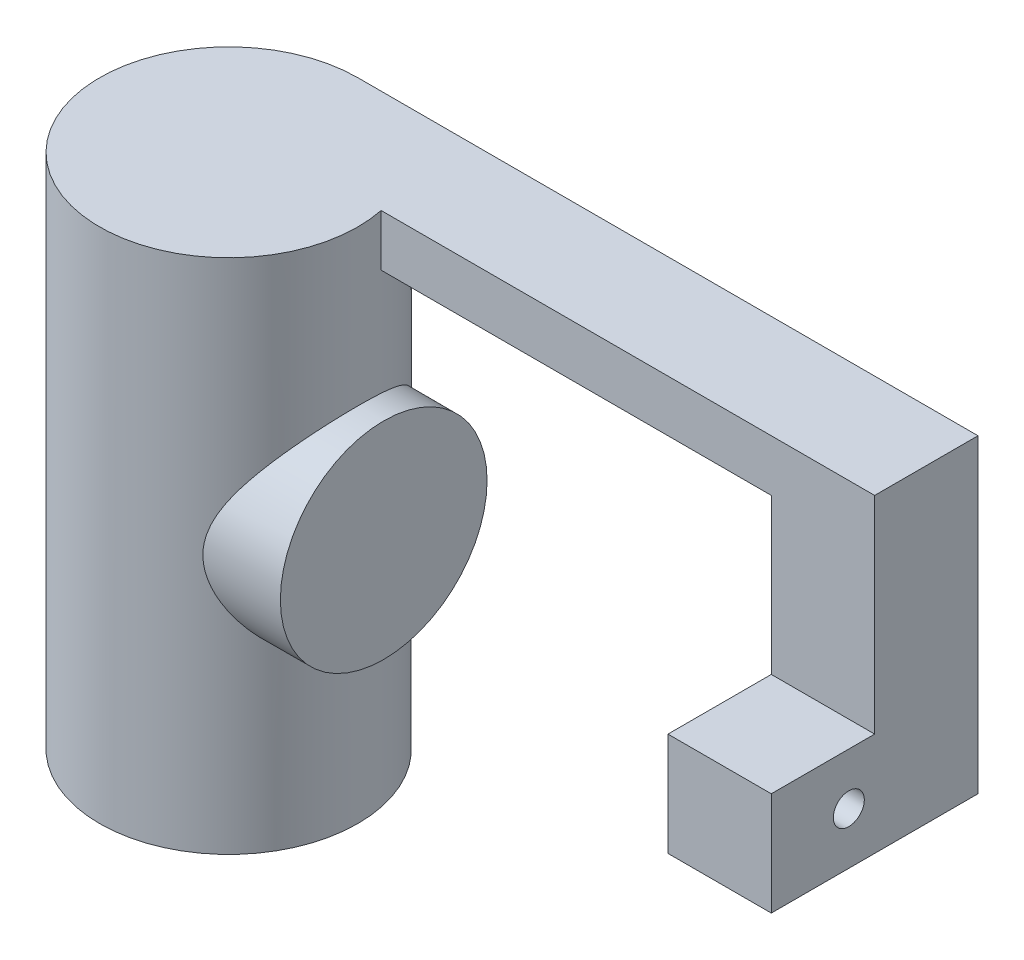
ISO-10303-21;
HEADER;
FILE_DESCRIPTION(('STEP AP214'),'2;1');
FILE_NAME('part.step','',(''),(''),'','','');
FILE_SCHEMA(('AUTOMOTIVE_DESIGN { 1 0 10303 214 1 1 1 1 }'));
ENDSEC;
DATA;
#1=APPLICATION_CONTEXT('core data for automotive mechanical design processes');
#2=APPLICATION_PROTOCOL_DEFINITION('international standard','automotive_design',2000,#1);
#3=PRODUCT_CONTEXT('',#1,'mechanical');
#4=PRODUCT('Part','Part','',(#3));
#5=PRODUCT_RELATED_PRODUCT_CATEGORY('part','',(#4));
#6=PRODUCT_DEFINITION_FORMATION('','',#4);
#7=PRODUCT_DEFINITION_CONTEXT('part definition',#1,'design');
#8=PRODUCT_DEFINITION('design','',#6,#7);
#9=PRODUCT_DEFINITION_SHAPE('','',#8);
#10=(LENGTH_UNIT() NAMED_UNIT(*) SI_UNIT(.MILLI.,.METRE.));
#11=(NAMED_UNIT(*) PLANE_ANGLE_UNIT() SI_UNIT($,.RADIAN.));
#12=(NAMED_UNIT(*) SI_UNIT($,.STERADIAN.) SOLID_ANGLE_UNIT());
#13=UNCERTAINTY_MEASURE_WITH_UNIT(LENGTH_MEASURE(1.E-05),#10,'distance_accuracy_value','');
#14=(GEOMETRIC_REPRESENTATION_CONTEXT(3) GLOBAL_UNCERTAINTY_ASSIGNED_CONTEXT((#13)) GLOBAL_UNIT_ASSIGNED_CONTEXT((#10,
#11,#12)) REPRESENTATION_CONTEXT('',''));
#15=CARTESIAN_POINT('',(0.,0.,0.));
#16=DIRECTION('',(0.,0.,1.));
#17=DIRECTION('',(1.,0.,0.));
#18=AXIS2_PLACEMENT_3D('',#15,#16,#17);
#19=CARTESIAN_POINT('',(232.360679774998,40.,-5.));
#20=DIRECTION('',(0.,1.,0.));
#21=DIRECTION('',(0.,0.,1.));
#22=AXIS2_PLACEMENT_3D('',#19,#20,#21);
#23=PLANE('',#22);
#24=DIRECTION('',(0.,0.,-1.));
#25=VECTOR('',#24,1.);
#26=CARTESIAN_POINT('',(100.,40.,-5.));
#27=LINE('',#26,#25);
#28=CARTESIAN_POINT('',(100.,40.,-5.));
#29=VERTEX_POINT('',#28);
#30=CARTESIAN_POINT('',(100.,40.,-25.));
#31=VERTEX_POINT('',#30);
#32=EDGE_CURVE('E130',#29,#31,#27,.T.);
#33=ORIENTED_EDGE('',*,*,#32,.F.);
#34=DIRECTION('',(-1.,0.,0.));
#35=VECTOR('',#34,1.);
#36=CARTESIAN_POINT('',(232.360679774998,40.,-5.));
#37=LINE('',#36,#35);
#38=CARTESIAN_POINT('',(24.4948974278318,40.,-5.));
#39=VERTEX_POINT('',#38);
#40=EDGE_CURVE('E62',#29,#39,#37,.T.);
#41=ORIENTED_EDGE('',*,*,#40,.T.);
#42=CARTESIAN_POINT('',(0.,40.,0.));
#43=DIRECTION('',(0.,1.,0.));
#44=DIRECTION('',(0.,0.,1.));
#45=AXIS2_PLACEMENT_3D('',#42,#43,#44);
#46=CIRCLE('',#45,25.);
#47=CARTESIAN_POINT('',(0.,40.,-25.));
#48=VERTEX_POINT('',#47);
#49=EDGE_CURVE('E12',#39,#48,#46,.T.);
#50=ORIENTED_EDGE('',*,*,#49,.T.);
#51=DIRECTION('',(-1.,0.,0.));
#52=VECTOR('',#51,1.);
#53=CARTESIAN_POINT('',(232.360679774998,40.,-25.));
#54=LINE('',#53,#52);
#55=EDGE_CURVE('E153',#31,#48,#54,.T.);
#56=ORIENTED_EDGE('',*,*,#55,.F.);
#57=EDGE_LOOP('',(#33,#41,#50,#56));
#58=FACE_BOUND('',#57,.T.);
#59=ADVANCED_FACE('F39',(#58),#23,.F.);
#60=CARTESIAN_POINT('',(0.,50.,0.));
#61=DIRECTION('',(0.,-1.,0.));
#62=DIRECTION('',(0.,0.,-1.));
#63=AXIS2_PLACEMENT_3D('',#60,#61,#62);
#64=CYLINDRICAL_SURFACE('',#63,25.);
#65=CARTESIAN_POINT('',(15.,0.,20.));
#66=CARTESIAN_POINT('',(15.0000088736725,-0.375561365561585,19.9999962926173));
#67=CARTESIAN_POINT('',(15.0141750346591,-0.751259573291653,19.9893930046637));
#68=CARTESIAN_POINT('',(15.070142772738,-1.49955766359186,19.9472295614098));
#69=CARTESIAN_POINT('',(15.1119631943118,-1.87215525787202,19.9156551156393));
#70=CARTESIAN_POINT('',(15.2213478980294,-2.61223578611677,19.8321780083143));
#71=CARTESIAN_POINT('',(15.2889813033108,-2.97970221671656,19.7802207542779));
#72=CARTESIAN_POINT('',(15.4470727059971,-3.70647875847824,19.6570076475307));
#73=CARTESIAN_POINT('',(15.5375387662973,-4.06578593940734,19.5857449768447));
#74=CARTESIAN_POINT('',(15.7052830755086,-4.65924234796872,19.4512611935685));
#75=CARTESIAN_POINT('',(15.777264008289,-4.89604979318361,19.3929770863774));
#76=CARTESIAN_POINT('',(15.9290175269818,-5.36495838353939,19.2685245813802));
#77=CARTESIAN_POINT('',(16.008787864795,-5.59706086336365,19.2023584571969));
#78=CARTESIAN_POINT('',(16.2583874663851,-6.28639950755564,18.9924204482248));
#79=CARTESIAN_POINT('',(16.438461109604,-6.7365147814177,18.837243748835));
#80=CARTESIAN_POINT('',(16.8189383053475,-7.61808786661511,18.4983342499176));
#81=CARTESIAN_POINT('',(17.0193868879852,-8.04950120855747,18.3145377001011));
#82=CARTESIAN_POINT('',(17.4341293267654,-8.89289471182062,17.9201862603243));
#83=CARTESIAN_POINT('',(17.6484228314515,-9.30487536598581,17.7096320494823));
#84=CARTESIAN_POINT('',(18.1648305832741,-10.2553974120961,17.1819650319468));
#85=CARTESIAN_POINT('',(18.4706788691686,-10.7858294871581,16.8538529821223));
#86=CARTESIAN_POINT('',(19.0880028760279,-11.8118379642277,16.1513803264203));
#87=CARTESIAN_POINT('',(19.3994805823717,-12.3074017550521,15.7770031209023));
#88=CARTESIAN_POINT('',(20.0190040941794,-13.2624424849901,14.9830857260937));
#89=CARTESIAN_POINT('',(20.327052455025,-13.7219480872222,14.5635820504617));
#90=CARTESIAN_POINT('',(20.9321249221037,-14.6033006830766,13.6796522230808));
#91=CARTESIAN_POINT('',(21.2291526745127,-15.025160198026,13.2152411157172));
#92=CARTESIAN_POINT('',(21.748027106478,-15.7488727978038,12.3381233033674));
#93=CARTESIAN_POINT('',(21.9731384202275,-16.0579745515095,11.9333126892403));
#94=CARTESIAN_POINT('',(22.4078243876689,-16.6478331858641,11.0955852490369));
#95=CARTESIAN_POINT('',(22.6173997412604,-16.9285913436069,10.6626696907469));
#96=CARTESIAN_POINT('',(23.0169572465042,-17.4588269628689,9.77028072461787));
#97=CARTESIAN_POINT('',(23.2069637984017,-17.708343465351,9.310841533003));
#98=CARTESIAN_POINT('',(23.5638648098979,-18.1735518121657,8.36653359290353));
#99=CARTESIAN_POINT('',(23.7307631030067,-18.3892492676466,7.88166908075929));
#100=CARTESIAN_POINT('',(24.0129006885665,-18.7518040690791,6.96924325820464));
#101=CARTESIAN_POINT('',(24.132129407249,-18.9041530577568,6.54509212186977));
#102=CARTESIAN_POINT('',(24.3496617753786,-19.1810681740325,5.68257829158782));
#103=CARTESIAN_POINT('',(24.4479675644109,-19.305637142486,5.24421705605759));
#104=CARTESIAN_POINT('',(24.6217593056216,-19.5252538478018,4.3558821644556));
#105=CARTESIAN_POINT('',(24.697253945882,-19.6203128245134,3.90591300054797));
#106=CARTESIAN_POINT('',(24.8239328453673,-19.7795341449066,2.99713406477301));
#107=CARTESIAN_POINT('',(24.875116814311,-19.8436961196631,2.53832418741135));
#108=CARTESIAN_POINT('',(24.9521996672002,-19.9402386753894,1.61360726200759));
#109=CARTESIAN_POINT('',(24.9780091489872,-19.9725068868928,1.1476809523183));
#110=CARTESIAN_POINT('',(25.0034458784075,-20.0043094777888,0.213992042391241));
#111=CARTESIAN_POINT('',(25.0030730756769,-20.0038437942145,-0.253770561377071));
#112=CARTESIAN_POINT('',(24.9761538060095,-19.9701867716747,-1.18736799204042));
#113=CARTESIAN_POINT('',(24.9496064528335,-19.9369943246195,-1.65320275312468));
#114=CARTESIAN_POINT('',(24.8709347186019,-19.8384544172188,-2.57925249006266));
#115=CARTESIAN_POINT('',(24.8188109274667,-19.7731076985111,-3.03946759528277));
#116=CARTESIAN_POINT('',(24.6936449338048,-19.6157650157554,-3.92597136214756));
#117=CARTESIAN_POINT('',(24.6219015200442,-19.5254205018148,-4.35273966221057));
#118=CARTESIAN_POINT('',(24.4579006470034,-19.3182016356292,-5.19571671792422));
#119=CARTESIAN_POINT('',(24.3656441088654,-19.2013284746489,-5.61192594679553));
#120=CARTESIAN_POINT('',(24.1621838322245,-18.9424794722292,-6.43174107520527));
#121=CARTESIAN_POINT('',(24.0509776242432,-18.8005003589476,-6.83534532396913));
#122=CARTESIAN_POINT('',(23.8113816719206,-18.4930035981065,-7.62821449404832));
#123=CARTESIAN_POINT('',(23.6829909080916,-18.3274845539852,-8.01747856287235));
#124=CARTESIAN_POINT('',(23.3977812813461,-17.9574879426194,-8.81708135492414));
#125=CARTESIAN_POINT('',(23.2394155993336,-17.7507939301222,-9.22584184459561));
#126=CARTESIAN_POINT('',(22.906772368539,-17.3130145334012,-10.0232967345393));
#127=CARTESIAN_POINT('',(22.7324939744453,-17.0819278532935,-10.4119900670894));
#128=CARTESIAN_POINT('',(22.3704779605334,-16.5971172246319,-11.1686012750122));
#129=CARTESIAN_POINT('',(22.1827357392803,-16.3433855295415,-11.5365119701174));
#130=CARTESIAN_POINT('',(21.7963253746775,-15.8149386877666,-12.2509255452122));
#131=CARTESIAN_POINT('',(21.5976557576735,-15.5402207089469,-12.5974255243352));
#132=CARTESIAN_POINT('',(21.1500639982279,-14.9125174759115,-13.3378586904546));
#133=CARTESIAN_POINT('',(20.8992219334084,-14.5550685913468,-13.7268549610686));
#134=CARTESIAN_POINT('',(20.3896591476269,-13.8134297991933,-14.4729375752678));
#135=CARTESIAN_POINT('',(20.1309371335264,-13.4292354891031,-14.8300186431678));
#136=CARTESIAN_POINT('',(19.6099503005857,-12.6348803465673,-15.5123917113823));
#137=CARTESIAN_POINT('',(19.3476817054736,-12.2246897841468,-15.8376461922545));
#138=CARTESIAN_POINT('',(18.8249798408101,-11.3793795574921,-16.4555095922113));
#139=CARTESIAN_POINT('',(18.5645463549802,-10.9442628880631,-16.7481224207045));
#140=CARTESIAN_POINT('',(18.0760476169757,-10.0922382908298,-17.2734617260135));
#141=CARTESIAN_POINT('',(17.8472812713524,-9.67761490271183,-17.5092418134772));
#142=CARTESIAN_POINT('',(17.4010467415081,-8.82764455668295,-17.9527853755262));
#143=CARTESIAN_POINT('',(17.1835798514243,-8.39229523590542,-18.1605456453044));
#144=CARTESIAN_POINT('',(16.766490943437,-7.50132950291147,-18.5463023979791));
#145=CARTESIAN_POINT('',(16.5668389427307,-7.04574915271813,-18.7243493460744));
#146=CARTESIAN_POINT('',(16.1924320055337,-6.11365179288613,-19.0490562055205));
#147=CARTESIAN_POINT('',(16.0176656946503,-5.63714447939481,-19.1957304717373));
#148=CARTESIAN_POINT('',(15.7494779227909,-4.81134027770838,-19.4158267954433));
#149=CARTESIAN_POINT('',(15.6474408209615,-4.46715880626483,-19.4979866901541));
#150=CARTESIAN_POINT('',(15.4628513048279,-3.7699691020778,-19.644697477778));
#151=CARTESIAN_POINT('',(15.3802925740366,-3.41696377193502,-19.7092540801845));
#152=CARTESIAN_POINT('',(15.2378089632064,-2.70415887126981,-19.8196196469868));
#153=CARTESIAN_POINT('',(15.1778430449527,-2.34437287828416,-19.8654626161209));
#154=CARTESIAN_POINT('',(15.0829006253516,-1.61954026555112,-19.9376452096634));
#155=CARTESIAN_POINT('',(15.0479235746009,-1.25449376164095,-19.9639852628618));
#156=CARTESIAN_POINT('',(15.004495765486,-0.519741930356911,-19.9966465151378));
#157=CARTESIAN_POINT('',(14.9962026395826,-0.150021824373883,-20.0028487541605));
#158=CARTESIAN_POINT('',(15.0070056423833,0.588778260838356,-19.9947448333189));
#159=CARTESIAN_POINT('',(15.0261013335287,0.957858250199638,-19.9804390010878));
#160=CARTESIAN_POINT('',(15.0907673124735,1.69276004301759,-19.9316421636585));
#161=CARTESIAN_POINT('',(15.1363693313635,2.05857740688934,-19.897126965185));
#162=CARTESIAN_POINT('',(15.2519500086948,2.78393767436353,-19.8086666638765));
#163=CARTESIAN_POINT('',(15.3219324158413,3.14347960412859,-19.7547185730151));
#164=CARTESIAN_POINT('',(15.5039537824714,3.94474949867919,-19.6123414444282));
#165=CARTESIAN_POINT('',(15.6221613393066,4.38413764893602,-19.5186334357215));
#166=CARTESIAN_POINT('',(15.8861506870295,5.24777425459926,-19.30437872468));
#167=CARTESIAN_POINT('',(16.0319410795805,5.67201793803901,-19.1838236480477));
#168=CARTESIAN_POINT('',(16.3453571903969,6.5053974046704,-18.9174959721956));
#169=CARTESIAN_POINT('',(16.5130356193875,6.91449355432119,-18.7716622095721));
#170=CARTESIAN_POINT('',(16.8645052787844,7.71630397644958,-18.4565497219518));
#171=CARTESIAN_POINT('',(17.0482972342497,8.10901751058542,-18.2872699417578));
#172=CARTESIAN_POINT('',(17.5141378978346,9.05448174997462,-17.8437728166938));
#173=CARTESIAN_POINT('',(17.8026475925749,9.59818744606174,-17.5569940558555));
#174=CARTESIAN_POINT('',(18.3923133044943,10.6521259877462,-16.9382926641353));
#175=CARTESIAN_POINT('',(18.6934744791287,11.1623449607814,-16.6063514966159));
#176=CARTESIAN_POINT('',(19.2993500057982,12.14977017796,-15.8981910771778));
#177=CARTESIAN_POINT('',(19.604067568823,12.6269433715611,-15.5219284847033));
#178=CARTESIAN_POINT('',(20.2087648819092,13.5467385964473,-14.7260197475678));
#179=CARTESIAN_POINT('',(20.5087453654267,13.9893660192377,-14.3063803965086));
#180=CARTESIAN_POINT('',(21.1010814398247,14.8442550460794,-13.4176591751879));
#181=CARTESIAN_POINT('',(21.3932659754237,15.2559901109569,-12.9479545282489));
#182=CARTESIAN_POINT('',(21.9582997842282,16.0387099798112,-11.96472790954));
#183=CARTESIAN_POINT('',(22.2311460291023,16.4096884063743,-11.451199102638));
#184=CARTESIAN_POINT('',(22.7496340984626,17.1055406908179,-10.3829352665371));
#185=CARTESIAN_POINT('',(22.9953486137735,17.4305384314257,-9.82831733877888));
#186=CARTESIAN_POINT('',(23.3385721876208,17.8801076354938,-8.96697709545808));
#187=CARTESIAN_POINT('',(23.448740173778,18.0236234193895,-8.67500917496761));
#188=CARTESIAN_POINT('',(23.6598323896979,18.2974119316906,-8.08155345049274));
#189=CARTESIAN_POINT('',(23.7607544783473,18.4276815933968,-7.78006346306885));
#190=CARTESIAN_POINT('',(23.9864150237953,18.7178828454875,-7.05977052154347));
#191=CARTESIAN_POINT('',(24.1069206872683,18.8719680361833,-6.63725388225576));
#192=CARTESIAN_POINT('',(24.3271756451156,19.1525199621413,-5.77799128175702));
#193=CARTESIAN_POINT('',(24.426930345177,19.2789938906448,-5.34124906072598));
#194=CARTESIAN_POINT('',(24.6038051925525,19.5026129269895,-4.45604509629661));
#195=CARTESIAN_POINT('',(24.6809373236533,19.5997735636586,-4.00758969530503));
#196=CARTESIAN_POINT('',(24.8110733743243,19.7633960613692,-3.10162102535077));
#197=CARTESIAN_POINT('',(24.8640764361472,19.8298568310838,-2.64410743498803));
#198=CARTESIAN_POINT('',(24.9449604563783,19.9311813368763,-1.72165098455351));
#199=CARTESIAN_POINT('',(24.9727480071601,19.9659275933639,-1.25668694235152));
#200=CARTESIAN_POINT('',(25.0022398851849,20.0028028698372,-0.324636920765033));
#201=CARTESIAN_POINT('',(25.0039443159793,20.0049320193146,0.14244905018793));
#202=CARTESIAN_POINT('',(24.9812313594413,19.9765360289776,1.07501253628732));
#203=CARTESIAN_POINT('',(24.9568122993052,19.9460087980292,1.54048994651549));
#204=CARTESIAN_POINT('',(24.8823991138229,19.852822771282,2.46613028976822));
#205=CARTESIAN_POINT('',(24.8324055484018,19.7901646789523,2.92629333891921));
#206=CARTESIAN_POINT('',(24.7112783596282,19.6379550163403,3.81343860295224));
#207=CARTESIAN_POINT('',(24.6414224290542,19.5500261634115,4.2408766972769));
#208=CARTESIAN_POINT('',(24.4810822615916,19.3475376045485,5.08540514048392));
#209=CARTESIAN_POINT('',(24.3905989317902,19.2329790696467,5.50249594349304));
#210=CARTESIAN_POINT('',(24.1905493315002,18.9786417620177,6.32425481235322));
#211=CARTESIAN_POINT('',(24.0809804312658,18.8388595136921,6.72892115722401));
#212=CARTESIAN_POINT('',(23.8445097564192,18.5356319173577,7.52405713766176));
#213=CARTESIAN_POINT('',(23.7176069710047,18.3721851893531,7.91452594363564));
#214=CARTESIAN_POINT('',(23.435792971905,18.0069741535771,8.71551599708837));
#215=CARTESIAN_POINT('',(23.2793746325239,17.8030600981142,9.12452586284841));
#216=CARTESIAN_POINT('',(22.9505208202088,17.3708397932964,9.92269877577447));
#217=CARTESIAN_POINT('',(22.7780845268679,17.1425322944691,10.3118608047917));
#218=CARTESIAN_POINT('',(22.4196291139931,16.6632855241318,11.0695956858229));
#219=CARTESIAN_POINT('',(22.2336057355117,16.4123391504941,11.4381620175476));
#220=CARTESIAN_POINT('',(21.8504812379481,15.8894676764289,12.1540671210363));
#221=CARTESIAN_POINT('',(21.6533786207584,15.6175397370637,12.5014030087528));
#222=CARTESIAN_POINT('',(21.2093319256466,14.9964049343675,13.2433919812304));
#223=CARTESIAN_POINT('',(20.9604424512646,14.6427713706468,13.6331825209505));
#224=CARTESIAN_POINT('',(20.4544911079644,13.908878699446,14.3811580620588));
#225=CARTESIAN_POINT('',(20.1974279286196,13.5286153107423,14.7393379604498));
#226=CARTESIAN_POINT('',(19.6793744983526,12.7422691821517,15.4242266229859));
#227=CARTESIAN_POINT('',(19.4183799698283,12.3361564929569,15.750897736964));
#228=CARTESIAN_POINT('',(18.8977264748114,11.4991956764628,16.3719288348251));
#229=CARTESIAN_POINT('',(18.6380673636508,11.0683502927338,16.6662923920412));
#230=CARTESIAN_POINT('',(18.1464213371624,10.2177829386944,17.1996539797735));
#231=CARTESIAN_POINT('',(17.9138936542805,9.79997472394165,17.4412037102238));
#232=CARTESIAN_POINT('',(17.4598987877254,8.94316246516532,17.8956723308303));
#233=CARTESIAN_POINT('',(17.2384330856758,8.50415559723356,18.1085873921353));
#234=CARTESIAN_POINT('',(16.8131298776554,7.60512559780488,18.5041297985685));
#235=CARTESIAN_POINT('',(16.6092684112044,7.14513237707597,18.6867986318384));
#236=CARTESIAN_POINT('',(16.3222934934104,6.43920528015332,18.9367073332312));
#237=CARTESIAN_POINT('',(16.2297866385868,6.20128511992555,19.0159821477095));
#238=CARTESIAN_POINT('',(16.0520749254619,5.72006488967305,19.1662311715375));
#239=CARTESIAN_POINT('',(15.9668719304727,5.47676346661397,19.2372032644263));
#240=CARTESIAN_POINT('',(15.7719192862284,4.88469439361789,19.3976380854507));
#241=CARTESIAN_POINT('',(15.6663258187387,4.53337259601621,19.4828412250051));
#242=CARTESIAN_POINT('',(15.4753395886442,3.82146578549283,19.6348871812494));
#243=CARTESIAN_POINT('',(15.3899397410734,3.46088407079989,19.7017364387605));
#244=CARTESIAN_POINT('',(15.2427899112173,2.73299414839423,19.8158023757433));
#245=CARTESIAN_POINT('',(15.1809684476404,2.36570986624404,19.8630784321024));
#246=CARTESIAN_POINT('',(15.0834023040712,1.62579828749899,19.9372716028599));
#247=CARTESIAN_POINT('',(15.047639365899,1.25317491880971,19.9642029724643));
#248=CARTESIAN_POINT('',(15.0171901387789,0.733091557313932,19.9870977278165));
#249=CARTESIAN_POINT('',(15.0107508892615,0.586606371828128,19.9919330770175));
#250=CARTESIAN_POINT('',(15.0021538078059,0.29342110302062,19.9983851468271));
#251=CARTESIAN_POINT('',(14.9999965333121,0.146720994206791,20.0000014483675));
#252=CARTESIAN_POINT('',(15.,0.,20.));
#253=B_SPLINE_CURVE_WITH_KNOTS('',3,(#65,#66,#67,#68,#69,#70,#71,#72,#73,#74,#75,#76,#77,#78,
#79,#80,#81,#82,#83,#84,#85,#86,#87,#88,#89,#90,#91,#92,#93,#94,#95,#96,#97,#98,#99,#100,#101,
#102,#103,#104,#105,#106,#107,#108,#109,#110,#111,#112,#113,#114,#115,#116,#117,#118,#119,#120,
#121,#122,#123,#124,#125,#126,#127,#128,#129,#130,#131,#132,#133,#134,#135,#136,#137,#138,#139,
#140,#141,#142,#143,#144,#145,#146,#147,#148,#149,#150,#151,#152,#153,#154,#155,#156,#157,#158,
#159,#160,#161,#162,#163,#164,#165,#166,#167,#168,#169,#170,#171,#172,#173,#174,#175,#176,#177,
#178,#179,#180,#181,#182,#183,#184,#185,#186,#187,#188,#189,#190,#191,#192,#193,#194,#195,#196,
#197,#198,#199,#200,#201,#202,#203,#204,#205,#206,#207,#208,#209,#210,#211,#212,#213,#214,#215,
#216,#217,#218,#219,#220,#221,#222,#223,#224,#225,#226,#227,#228,#229,#230,#231,#232,#233,#234,
#235,#236,#237,#238,#239,#240,#241,#242,#243,#244,#245,#246,#247,#248,#249,#250,#251,#252),
.UNSPECIFIED.,.T.,.F.,(4,2,2,2,2,2,2,2,2,2,2,2,2,2,2,2,2,2,2,2,2,2,2,2,2,2,2,2,2,2,2,2,2,2,2,2,
2,2,2,2,2,2,2,2,2,2,2,2,2,2,2,2,2,2,2,2,2,2,2,2,2,2,2,2,2,2,2,2,2,2,2,2,2,2,2,2,2,2,2,2,2,2,2,2,
2,2,2,2,2,2,2,2,2,4),(0.,1.12651574952473,2.2537999344042,3.3841242341917,4.51484824523439,
5.27739675794963,6.03972583845545,7.56486868792285,9.09345869330433,10.6220099103027,
12.7033327859322,14.7854046068517,16.8658042338039,18.9455093073508,20.6145867164359,
22.2835888873329,23.9504841293649,25.617102512125,27.0142554580865,28.4112654620493,
29.8077427141851,31.2042366405157,32.6056333996718,34.0070328545445,35.4084797607792,
36.8098943441777,38.1347256488484,39.4594974739462,40.7844420725439,42.1094653094182,
43.5620343914882,45.0146806815627,46.4678258200048,47.921167410504,49.6739596258463,
51.4270410495421,53.1821648420752,54.9370782016407,56.5229157235616,58.1089344743811,
59.6922314901944,61.2748024964205,62.3787128562362,63.4822647441278,64.5838023331136,
65.6853157030333,66.7933243129855,67.9013152217966,69.0106352615765,70.1201259446855,
71.5116354138465,72.9035795404123,74.2989398143853,75.6943629075203,77.7286442161459,
79.7637630163798,81.8008886805686,83.8376957752715,85.9037141544938,87.9700553558267,
90.0307187759073,91.0607299822863,92.0909791131436,93.4862959450826,94.8812488364182,
96.2754614433078,97.6697236082186,99.0691298009904,100.468530438043,101.868020690334,
103.267480303666,104.591878389361,105.916218246054,107.240740724274,108.565340473252,
110.013105171573,111.460944062375,112.909238750287,114.357729746375,116.102639440861,
117.847830307862,119.595081337061,121.342138918783,122.948043417708,124.554162435227,
126.158059786143,126.959714545967,127.761573213736,128.890375919398,130.018781993105,
131.143739420532,132.267907874765,132.707947806639,133.148045020879),.UNSPECIFIED.);
#254=CARTESIAN_POINT('',(15.,0.,20.));
#255=VERTEX_POINT('',#254);
#256=EDGE_CURVE('E48',#255,#255,#253,.T.);
#257=ORIENTED_EDGE('',*,*,#256,.F.);
#258=EDGE_LOOP('',(#257));
#259=FACE_BOUND('',#258,.T.);
#260=CARTESIAN_POINT('',(0.,-50.,0.));
#261=DIRECTION('',(0.,1.,0.));
#262=DIRECTION('',(0.,0.,1.));
#263=AXIS2_PLACEMENT_3D('',#260,#261,#262);
#264=CIRCLE('',#263,25.);
#265=CARTESIAN_POINT('',(0.,-50.,25.));
#266=VERTEX_POINT('',#265);
#267=EDGE_CURVE('E171',#266,#266,#264,.T.);
#268=ORIENTED_EDGE('',*,*,#267,.T.);
#269=EDGE_LOOP('',(#268));
#270=FACE_BOUND('',#269,.T.);
#271=DIRECTION('',(0.,-1.,0.));
#272=VECTOR('',#271,1.);
#273=CARTESIAN_POINT('',(24.4948974278318,50.,-5.));
#274=LINE('',#273,#272);
#275=CARTESIAN_POINT('',(24.4948974278318,50.,-5.));
#276=VERTEX_POINT('',#275);
#277=EDGE_CURVE('E156',#276,#39,#274,.T.);
#278=ORIENTED_EDGE('',*,*,#277,.F.);
#279=CARTESIAN_POINT('',(0.,50.,0.));
#280=DIRECTION('',(0.,1.,0.));
#281=DIRECTION('',(0.,0.,1.));
#282=AXIS2_PLACEMENT_3D('',#279,#280,#281);
#283=CIRCLE('',#282,25.);
#284=CARTESIAN_POINT('',(0.,50.,-25.));
#285=VERTEX_POINT('',#284);
#286=EDGE_CURVE('E172',#285,#276,#283,.T.);
#287=ORIENTED_EDGE('',*,*,#286,.F.);
#288=DIRECTION('',(0.,1.,0.));
#289=VECTOR('',#288,1.);
#290=CARTESIAN_POINT('',(0.,50.,-25.));
#291=LINE('',#290,#289);
#292=EDGE_CURVE('E149',#48,#285,#291,.T.);
#293=ORIENTED_EDGE('',*,*,#292,.F.);
#294=ORIENTED_EDGE('',*,*,#49,.F.);
#295=EDGE_LOOP('',(#278,#287,#293,#294));
#296=FACE_BOUND('',#295,.T.);
#297=ADVANCED_FACE('F41',(#259,#270,#296),#64,.T.);
#298=CARTESIAN_POINT('',(0.,50.,0.));
#299=DIRECTION('',(0.,1.,0.));
#300=DIRECTION('',(0.,0.,1.));
#301=AXIS2_PLACEMENT_3D('',#298,#299,#300);
#302=PLANE('',#301);
#303=ORIENTED_EDGE('',*,*,#286,.T.);
#304=DIRECTION('',(-1.,0.,0.));
#305=VECTOR('',#304,1.);
#306=CARTESIAN_POINT('',(232.360679774998,50.,-5.));
#307=LINE('',#306,#305);
#308=CARTESIAN_POINT('',(120.,50.,-5.));
#309=VERTEX_POINT('',#308);
#310=EDGE_CURVE('E148',#309,#276,#307,.T.);
#311=ORIENTED_EDGE('',*,*,#310,.F.);
#312=DIRECTION('',(0.,0.,1.));
#313=VECTOR('',#312,1.);
#314=CARTESIAN_POINT('',(120.,50.,-5.));
#315=LINE('',#314,#313);
#316=CARTESIAN_POINT('',(120.,50.,-25.));
#317=VERTEX_POINT('',#316);
#318=EDGE_CURVE('E158',#317,#309,#315,.T.);
#319=ORIENTED_EDGE('',*,*,#318,.F.);
#320=DIRECTION('',(-1.,0.,0.));
#321=VECTOR('',#320,1.);
#322=CARTESIAN_POINT('',(232.360679774998,50.,-25.));
#323=LINE('',#322,#321);
#324=EDGE_CURVE('E152',#317,#285,#323,.T.);
#325=ORIENTED_EDGE('',*,*,#324,.T.);
#326=EDGE_LOOP('',(#303,#311,#319,#325));
#327=FACE_BOUND('',#326,.T.);
#328=ADVANCED_FACE('F190',(#327),#302,.T.);
#329=CARTESIAN_POINT('',(0.,-50.,0.));
#330=DIRECTION('',(0.,1.,0.));
#331=DIRECTION('',(0.,0.,1.));
#332=AXIS2_PLACEMENT_3D('',#329,#330,#331);
#333=PLANE('',#332);
#334=ORIENTED_EDGE('',*,*,#267,.F.);
#335=EDGE_LOOP('',(#334));
#336=FACE_BOUND('',#335,.T.);
#337=ADVANCED_FACE('F187',(#336),#333,.F.);
#338=CARTESIAN_POINT('',(30.,0.,0.));
#339=DIRECTION('',(-1.,0.,0.));
#340=DIRECTION('',(0.,0.,1.));
#341=AXIS2_PLACEMENT_3D('',#338,#339,#340);
#342=CYLINDRICAL_SURFACE('',#341,20.);
#343=CARTESIAN_POINT('',(30.,0.,0.));
#344=DIRECTION('',(1.,0.,0.));
#345=DIRECTION('',(0.,0.,-1.));
#346=AXIS2_PLACEMENT_3D('',#343,#344,#345);
#347=CIRCLE('',#346,20.);
#348=CARTESIAN_POINT('',(30.,0.,-20.));
#349=VERTEX_POINT('',#348);
#350=EDGE_CURVE('E168',#349,#349,#347,.T.);
#351=ORIENTED_EDGE('',*,*,#350,.F.);
#352=EDGE_LOOP('',(#351));
#353=FACE_BOUND('',#352,.T.);
#354=ORIENTED_EDGE('',*,*,#256,.T.);
#355=EDGE_LOOP('',(#354));
#356=FACE_BOUND('',#355,.T.);
#357=ADVANCED_FACE('F181',(#353,#356),#342,.T.);
#358=CARTESIAN_POINT('',(30.,0.,0.));
#359=DIRECTION('',(1.,0.,0.));
#360=DIRECTION('',(0.,0.,-1.));
#361=AXIS2_PLACEMENT_3D('',#358,#359,#360);
#362=PLANE('',#361);
#363=ORIENTED_EDGE('',*,*,#350,.T.);
#364=EDGE_LOOP('',(#363));
#365=FACE_BOUND('',#364,.T.);
#366=ADVANCED_FACE('F186',(#365),#362,.T.);
#367=CARTESIAN_POINT('',(232.360679774998,50.,-5.));
#368=DIRECTION('',(0.,0.,-1.));
#369=DIRECTION('',(0.,1.,0.));
#370=AXIS2_PLACEMENT_3D('',#367,#368,#369);
#371=PLANE('',#370);
#372=DIRECTION('',(0.,1.,0.));
#373=VECTOR('',#372,1.);
#374=CARTESIAN_POINT('',(100.,-10.,-5.));
#375=LINE('',#374,#373);
#376=CARTESIAN_POINT('',(100.,10.,-5.));
#377=VERTEX_POINT('',#376);
#378=EDGE_CURVE('E146',#377,#29,#375,.T.);
#379=ORIENTED_EDGE('',*,*,#378,.F.);
#380=DIRECTION('',(1.,0.,0.));
#381=VECTOR('',#380,1.);
#382=CARTESIAN_POINT('',(232.360679774998,9.99999999999999,-5.));
#383=LINE('',#382,#381);
#384=CARTESIAN_POINT('',(120.,10.,-5.));
#385=VERTEX_POINT('',#384);
#386=EDGE_CURVE('E127',#377,#385,#383,.T.);
#387=ORIENTED_EDGE('',*,*,#386,.T.);
#388=DIRECTION('',(0.,-1.,0.));
#389=VECTOR('',#388,1.);
#390=CARTESIAN_POINT('',(120.,50.,-5.));
#391=LINE('',#390,#389);
#392=EDGE_CURVE('E121',#309,#385,#391,.T.);
#393=ORIENTED_EDGE('',*,*,#392,.F.);
#394=ORIENTED_EDGE('',*,*,#310,.T.);
#395=ORIENTED_EDGE('',*,*,#277,.T.);
#396=ORIENTED_EDGE('',*,*,#40,.F.);
#397=EDGE_LOOP('',(#379,#387,#393,#394,#395,#396));
#398=FACE_BOUND('',#397,.T.);
#399=ADVANCED_FACE('F208',(#398),#371,.F.);
#400=CARTESIAN_POINT('',(232.360679774998,50.,-25.));
#401=DIRECTION('',(0.,0.,1.));
#402=DIRECTION('',(0.,-1.,0.));
#403=AXIS2_PLACEMENT_3D('',#400,#401,#402);
#404=PLANE('',#403);
#405=ORIENTED_EDGE('',*,*,#324,.F.);
#406=DIRECTION('',(0.,1.,0.));
#407=VECTOR('',#406,1.);
#408=CARTESIAN_POINT('',(120.,50.,-25.));
#409=LINE('',#408,#407);
#410=CARTESIAN_POINT('',(120.,-10.,-25.));
#411=VERTEX_POINT('',#410);
#412=EDGE_CURVE('E154',#411,#317,#409,.T.);
#413=ORIENTED_EDGE('',*,*,#412,.F.);
#414=DIRECTION('',(1.,0.,0.));
#415=VECTOR('',#414,1.);
#416=CARTESIAN_POINT('',(120.,-10.,-25.));
#417=LINE('',#416,#415);
#418=CARTESIAN_POINT('',(100.,-10.,-25.));
#419=VERTEX_POINT('',#418);
#420=EDGE_CURVE('E139',#419,#411,#417,.T.);
#421=ORIENTED_EDGE('',*,*,#420,.F.);
#422=DIRECTION('',(0.,1.,0.));
#423=VECTOR('',#422,1.);
#424=CARTESIAN_POINT('',(100.,-10.,-25.));
#425=LINE('',#424,#423);
#426=EDGE_CURVE('E142',#419,#31,#425,.T.);
#427=ORIENTED_EDGE('',*,*,#426,.T.);
#428=ORIENTED_EDGE('',*,*,#55,.T.);
#429=ORIENTED_EDGE('',*,*,#292,.T.);
#430=EDGE_LOOP('',(#405,#413,#421,#427,#428,#429));
#431=FACE_BOUND('',#430,.T.);
#432=ADVANCED_FACE('F206',(#431),#404,.F.);
#433=CARTESIAN_POINT('',(120.,0.,0.));
#434=DIRECTION('',(1.,0.,0.));
#435=DIRECTION('',(0.,0.,-1.));
#436=AXIS2_PLACEMENT_3D('',#433,#434,#435);
#437=PLANE('',#436);
#438=CARTESIAN_POINT('',(120.,0.,0.));
#439=DIRECTION('',(1.,0.,0.));
#440=DIRECTION('',(0.,0.,-1.));
#441=AXIS2_PLACEMENT_3D('',#438,#439,#440);
#442=CIRCLE('',#441,3.);
#443=CARTESIAN_POINT('',(120.,0.,-3.));
#444=VERTEX_POINT('',#443);
#445=EDGE_CURVE('E223',#444,#444,#442,.T.);
#446=ORIENTED_EDGE('',*,*,#445,.F.);
#447=EDGE_LOOP('',(#446));
#448=FACE_BOUND('',#447,.T.);
#449=ORIENTED_EDGE('',*,*,#392,.T.);
#450=DIRECTION('',(0.,0.,-1.));
#451=VECTOR('',#450,1.);
#452=CARTESIAN_POINT('',(120.,9.99999999999999,63.2842712474619));
#453=LINE('',#452,#451);
#454=CARTESIAN_POINT('',(120.,10.,15.));
#455=VERTEX_POINT('',#454);
#456=EDGE_CURVE('E55',#455,#385,#453,.T.);
#457=ORIENTED_EDGE('',*,*,#456,.F.);
#458=DIRECTION('',(0.,1.,0.));
#459=VECTOR('',#458,1.);
#460=CARTESIAN_POINT('',(120.,-10.,15.));
#461=LINE('',#460,#459);
#462=CARTESIAN_POINT('',(120.,-10.,15.));
#463=VERTEX_POINT('',#462);
#464=EDGE_CURVE('E107',#463,#455,#461,.T.);
#465=ORIENTED_EDGE('',*,*,#464,.F.);
#466=DIRECTION('',(0.,0.,1.));
#467=VECTOR('',#466,1.);
#468=CARTESIAN_POINT('',(120.,-10.,-5.));
#469=LINE('',#468,#467);
#470=EDGE_CURVE('E135',#411,#463,#469,.T.);
#471=ORIENTED_EDGE('',*,*,#470,.F.);
#472=ORIENTED_EDGE('',*,*,#412,.T.);
#473=ORIENTED_EDGE('',*,*,#318,.T.);
#474=EDGE_LOOP('',(#449,#457,#465,#471,#472,#473));
#475=FACE_BOUND('',#474,.T.);
#476=ADVANCED_FACE('F118',(#448,#475),#437,.T.);
#477=CARTESIAN_POINT('',(100.,-10.,-5.));
#478=DIRECTION('',(1.,0.,0.));
#479=DIRECTION('',(0.,0.,-1.));
#480=AXIS2_PLACEMENT_3D('',#477,#478,#479);
#481=PLANE('',#480);
#482=CARTESIAN_POINT('',(100.,0.,0.));
#483=DIRECTION('',(1.,0.,0.));
#484=DIRECTION('',(0.,0.,-1.));
#485=AXIS2_PLACEMENT_3D('',#482,#483,#484);
#486=CIRCLE('',#485,3.);
#487=CARTESIAN_POINT('',(100.,0.,-3.));
#488=VERTEX_POINT('',#487);
#489=EDGE_CURVE('E225',#488,#488,#486,.F.);
#490=ORIENTED_EDGE('',*,*,#489,.F.);
#491=EDGE_LOOP('',(#490));
#492=FACE_BOUND('',#491,.T.);
#493=ORIENTED_EDGE('',*,*,#32,.T.);
#494=ORIENTED_EDGE('',*,*,#426,.F.);
#495=DIRECTION('',(0.,0.,-1.));
#496=VECTOR('',#495,1.);
#497=CARTESIAN_POINT('',(100.,-10.,-5.));
#498=LINE('',#497,#496);
#499=CARTESIAN_POINT('',(100.,-10.,15.));
#500=VERTEX_POINT('',#499);
#501=EDGE_CURVE('E137',#500,#419,#498,.T.);
#502=ORIENTED_EDGE('',*,*,#501,.F.);
#503=DIRECTION('',(0.,-1.,0.));
#504=VECTOR('',#503,1.);
#505=CARTESIAN_POINT('',(100.,-10.,15.));
#506=LINE('',#505,#504);
#507=CARTESIAN_POINT('',(100.,10.,15.));
#508=VERTEX_POINT('',#507);
#509=EDGE_CURVE('E128',#508,#500,#506,.T.);
#510=ORIENTED_EDGE('',*,*,#509,.F.);
#511=DIRECTION('',(0.,0.,-1.));
#512=VECTOR('',#511,1.);
#513=CARTESIAN_POINT('',(100.,9.99999999999999,63.2842712474619));
#514=LINE('',#513,#512);
#515=EDGE_CURVE('E122',#508,#377,#514,.T.);
#516=ORIENTED_EDGE('',*,*,#515,.T.);
#517=ORIENTED_EDGE('',*,*,#378,.T.);
#518=EDGE_LOOP('',(#493,#494,#502,#510,#516,#517));
#519=FACE_BOUND('',#518,.T.);
#520=ADVANCED_FACE('F212',(#492,#519),#481,.F.);
#521=CARTESIAN_POINT('',(0.,-10.,0.));
#522=DIRECTION('',(0.,1.,0.));
#523=DIRECTION('',(0.,0.,1.));
#524=AXIS2_PLACEMENT_3D('',#521,#522,#523);
#525=PLANE('',#524);
#526=ORIENTED_EDGE('',*,*,#470,.T.);
#527=DIRECTION('',(1.,0.,0.));
#528=VECTOR('',#527,1.);
#529=CARTESIAN_POINT('',(100.,-10.,15.));
#530=LINE('',#529,#528);
#531=EDGE_CURVE('E113',#500,#463,#530,.T.);
#532=ORIENTED_EDGE('',*,*,#531,.F.);
#533=ORIENTED_EDGE('',*,*,#501,.T.);
#534=ORIENTED_EDGE('',*,*,#420,.T.);
#535=EDGE_LOOP('',(#526,#532,#533,#534));
#536=FACE_BOUND('',#535,.T.);
#537=ADVANCED_FACE('F218',(#536),#525,.F.);
#538=CARTESIAN_POINT('',(100.,9.99999999999999,63.2842712474619));
#539=DIRECTION('',(0.,1.,0.));
#540=DIRECTION('',(0.,0.,1.));
#541=AXIS2_PLACEMENT_3D('',#538,#539,#540);
#542=PLANE('',#541);
#543=ORIENTED_EDGE('',*,*,#386,.F.);
#544=ORIENTED_EDGE('',*,*,#515,.F.);
#545=DIRECTION('',(-1.,0.,0.));
#546=VECTOR('',#545,1.);
#547=CARTESIAN_POINT('',(100.,10.,15.));
#548=LINE('',#547,#546);
#549=EDGE_CURVE('E110',#455,#508,#548,.T.);
#550=ORIENTED_EDGE('',*,*,#549,.F.);
#551=ORIENTED_EDGE('',*,*,#456,.T.);
#552=EDGE_LOOP('',(#543,#544,#550,#551));
#553=FACE_BOUND('',#552,.T.);
#554=ADVANCED_FACE('F125',(#553),#542,.T.);
#555=CARTESIAN_POINT('',(232.360679774998,50.,15.));
#556=DIRECTION('',(0.,0.,-1.));
#557=DIRECTION('',(0.,1.,0.));
#558=AXIS2_PLACEMENT_3D('',#555,#556,#557);
#559=PLANE('',#558);
#560=ORIENTED_EDGE('',*,*,#509,.T.);
#561=ORIENTED_EDGE('',*,*,#531,.T.);
#562=ORIENTED_EDGE('',*,*,#464,.T.);
#563=ORIENTED_EDGE('',*,*,#549,.T.);
#564=EDGE_LOOP('',(#560,#561,#562,#563));
#565=FACE_BOUND('',#564,.T.);
#566=ADVANCED_FACE('F109',(#565),#559,.F.);
#567=CARTESIAN_POINT('',(91.5147186257614,0.,0.));
#568=DIRECTION('',(1.,0.,0.));
#569=DIRECTION('',(0.,0.,-1.));
#570=AXIS2_PLACEMENT_3D('',#567,#568,#569);
#571=CYLINDRICAL_SURFACE('',#570,3.);
#572=ORIENTED_EDGE('',*,*,#489,.T.);
#573=EDGE_LOOP('',(#572));
#574=FACE_BOUND('',#573,.T.);
#575=ORIENTED_EDGE('',*,*,#445,.T.);
#576=EDGE_LOOP('',(#575));
#577=FACE_BOUND('',#576,.T.);
#578=ADVANCED_FACE('F251',(#574,#577),#571,.F.);
#579=CLOSED_SHELL('',(#59,#297,#328,#337,#357,#366,#399,#432,#476,#520,#537,#554,#566,#578));
#580=MANIFOLD_SOLID_BREP('B2',#579);
#581=ADVANCED_BREP_SHAPE_REPRESENTATION('',(#18,#580),#14);
#582=SHAPE_DEFINITION_REPRESENTATION(#9,#581);
ENDSEC;
END-ISO-10303-21;
